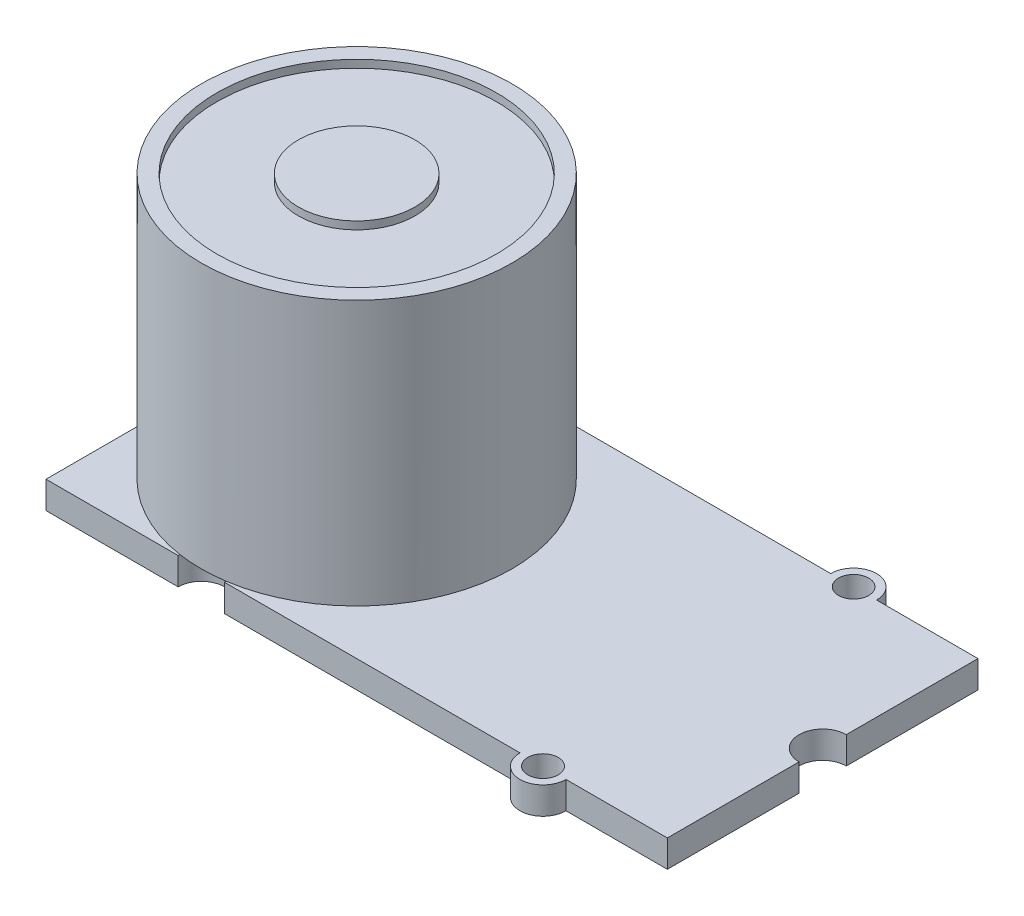
ISO-10303-21;
HEADER;
FILE_DESCRIPTION(('STEP AP214'),'2;1');
FILE_NAME('part.step','',(''),(''),'','','');
FILE_SCHEMA(('AUTOMOTIVE_DESIGN { 1 0 10303 214 1 1 1 1 }'));
ENDSEC;
DATA;
#1=APPLICATION_CONTEXT('core data for automotive mechanical design processes');
#2=APPLICATION_PROTOCOL_DEFINITION('international standard','automotive_design',2000,#1);
#3=PRODUCT_CONTEXT('',#1,'mechanical');
#4=PRODUCT('Part','Part','',(#3));
#5=PRODUCT_RELATED_PRODUCT_CATEGORY('part','',(#4));
#6=PRODUCT_DEFINITION_FORMATION('','',#4);
#7=PRODUCT_DEFINITION_CONTEXT('part definition',#1,'design');
#8=PRODUCT_DEFINITION('design','',#6,#7);
#9=PRODUCT_DEFINITION_SHAPE('','',#8);
#10=(LENGTH_UNIT() NAMED_UNIT(*) SI_UNIT(.MILLI.,.METRE.));
#11=(NAMED_UNIT(*) PLANE_ANGLE_UNIT() SI_UNIT($,.RADIAN.));
#12=(NAMED_UNIT(*) SI_UNIT($,.STERADIAN.) SOLID_ANGLE_UNIT());
#13=UNCERTAINTY_MEASURE_WITH_UNIT(LENGTH_MEASURE(1.E-05),#10,'distance_accuracy_value','');
#14=(GEOMETRIC_REPRESENTATION_CONTEXT(3) GLOBAL_UNCERTAINTY_ASSIGNED_CONTEXT((#13)) GLOBAL_UNIT_ASSIGNED_CONTEXT((#10,
#11,#12)) REPRESENTATION_CONTEXT('',''));
#15=CARTESIAN_POINT('',(0.,0.,0.));
#16=DIRECTION('',(0.,0.,1.));
#17=DIRECTION('',(1.,0.,0.));
#18=AXIS2_PLACEMENT_3D('',#15,#16,#17);
#19=CARTESIAN_POINT('',(-20.,1.75,-10.));
#20=DIRECTION('',(0.,0.,1.));
#21=DIRECTION('',(1.,0.,0.));
#22=AXIS2_PLACEMENT_3D('',#19,#20,#21);
#23=PLANE('',#22);
#24=DIRECTION('',(-1.,0.,0.));
#25=VECTOR('',#24,1.);
#26=CARTESIAN_POINT('',(-20.,0.,-10.));
#27=LINE('',#26,#25);
#28=CARTESIAN_POINT('',(20.,0.,-10.));
#29=VERTEX_POINT('',#28);
#30=CARTESIAN_POINT('',(13.4700440446538,0.,-10.));
#31=VERTEX_POINT('',#30);
#32=EDGE_CURVE('E182',#29,#31,#27,.T.);
#33=ORIENTED_EDGE('',*,*,#32,.T.);
#34=DIRECTION('',(0.,1.,0.));
#35=VECTOR('',#34,1.);
#36=CARTESIAN_POINT('',(13.4700440446538,-4.19218826280696,-10.));
#37=LINE('',#36,#35);
#38=CARTESIAN_POINT('',(13.4700440446538,1.75,-10.));
#39=VERTEX_POINT('',#38);
#40=EDGE_CURVE('E168',#31,#39,#37,.T.);
#41=ORIENTED_EDGE('',*,*,#40,.T.);
#42=DIRECTION('',(-1.,0.,0.));
#43=VECTOR('',#42,1.);
#44=CARTESIAN_POINT('',(-20.,1.75,-10.));
#45=LINE('',#44,#43);
#46=CARTESIAN_POINT('',(20.,1.75,-10.));
#47=VERTEX_POINT('',#46);
#48=EDGE_CURVE('E179',#47,#39,#45,.T.);
#49=ORIENTED_EDGE('',*,*,#48,.F.);
#50=DIRECTION('',(0.,-1.,0.));
#51=VECTOR('',#50,1.);
#52=CARTESIAN_POINT('',(20.,1.75,-10.));
#53=LINE('',#52,#51);
#54=EDGE_CURVE('E430',#47,#29,#53,.T.);
#55=ORIENTED_EDGE('',*,*,#54,.T.);
#56=EDGE_LOOP('',(#33,#41,#49,#55));
#57=FACE_BOUND('',#56,.T.);
#58=ADVANCED_FACE('F51',(#57),#23,.F.);
#59=CARTESIAN_POINT('',(-20.,1.75,10.));
#60=DIRECTION('',(0.,0.,-1.));
#61=DIRECTION('',(-1.,0.,0.));
#62=AXIS2_PLACEMENT_3D('',#59,#60,#61);
#63=PLANE('',#62);
#64=DIRECTION('',(1.,0.,0.));
#65=VECTOR('',#64,1.);
#66=CARTESIAN_POINT('',(-20.,0.,10.));
#67=LINE('',#66,#65);
#68=CARTESIAN_POINT('',(-8.50551142275667,0.,10.));
#69=VERTEX_POINT('',#68);
#70=CARTESIAN_POINT('',(10.511788005974,0.,10.));
#71=VERTEX_POINT('',#70);
#72=EDGE_CURVE('E409',#69,#71,#67,.T.);
#73=ORIENTED_EDGE('',*,*,#72,.T.);
#74=DIRECTION('',(0.,1.,0.));
#75=VECTOR('',#74,1.);
#76=CARTESIAN_POINT('',(10.511788005974,-4.19218826280696,10.));
#77=LINE('',#76,#75);
#78=CARTESIAN_POINT('',(10.511788005974,1.75,10.));
#79=VERTEX_POINT('',#78);
#80=EDGE_CURVE('E280',#71,#79,#77,.T.);
#81=ORIENTED_EDGE('',*,*,#80,.T.);
#82=DIRECTION('',(1.,0.,0.));
#83=VECTOR('',#82,1.);
#84=CARTESIAN_POINT('',(-20.,1.75,10.));
#85=LINE('',#84,#83);
#86=CARTESIAN_POINT('',(-8.50551142275667,1.75,10.));
#87=VERTEX_POINT('',#86);
#88=EDGE_CURVE('E448',#87,#79,#85,.T.);
#89=ORIENTED_EDGE('',*,*,#88,.F.);
#90=DIRECTION('',(0.,-1.,0.));
#91=VECTOR('',#90,1.);
#92=CARTESIAN_POINT('',(-8.50551142275667,6.11740276973975,10.));
#93=LINE('',#92,#91);
#94=EDGE_CURVE('E251',#87,#69,#93,.T.);
#95=ORIENTED_EDGE('',*,*,#94,.T.);
#96=EDGE_LOOP('',(#73,#81,#89,#95));
#97=FACE_BOUND('',#96,.T.);
#98=ADVANCED_FACE('F342',(#97),#63,.F.);
#99=CARTESIAN_POINT('',(-11.5441100573279,1.75,-10.));
#100=VERTEX_POINT('',#99);
#101=CARTESIAN_POINT('',(-20.,1.75,-10.));
#102=VERTEX_POINT('',#101);
#103=EDGE_CURVE('E194',#100,#102,#45,.T.);
#104=ORIENTED_EDGE('',*,*,#103,.F.);
#105=DIRECTION('',(0.,-1.,0.));
#106=VECTOR('',#105,1.);
#107=CARTESIAN_POINT('',(-11.5441100573279,6.11740276973975,-10.));
#108=LINE('',#107,#106);
#109=CARTESIAN_POINT('',(-11.5441100573279,0.,-10.));
#110=VERTEX_POINT('',#109);
#111=EDGE_CURVE('E259',#100,#110,#108,.T.);
#112=ORIENTED_EDGE('',*,*,#111,.T.);
#113=CARTESIAN_POINT('',(-20.,0.,-10.));
#114=VERTEX_POINT('',#113);
#115=EDGE_CURVE('E398',#110,#114,#27,.T.);
#116=ORIENTED_EDGE('',*,*,#115,.T.);
#117=DIRECTION('',(0.,-1.,0.));
#118=VECTOR('',#117,1.);
#119=CARTESIAN_POINT('',(-20.,1.75,-10.));
#120=LINE('',#119,#118);
#121=EDGE_CURVE('E426',#102,#114,#120,.T.);
#122=ORIENTED_EDGE('',*,*,#121,.F.);
#123=EDGE_LOOP('',(#104,#112,#116,#122));
#124=FACE_BOUND('',#123,.T.);
#125=ADVANCED_FACE('F343',(#124),#23,.F.);
#126=CARTESIAN_POINT('',(13.4761127546155,1.75,10.));
#127=VERTEX_POINT('',#126);
#128=CARTESIAN_POINT('',(20.,1.75,10.));
#129=VERTEX_POINT('',#128);
#130=EDGE_CURVE('E446',#127,#129,#85,.T.);
#131=ORIENTED_EDGE('',*,*,#130,.F.);
#132=DIRECTION('',(0.,1.,0.));
#133=VECTOR('',#132,1.);
#134=CARTESIAN_POINT('',(13.4761127546155,-4.19218826280696,10.));
#135=LINE('',#134,#133);
#136=CARTESIAN_POINT('',(13.4761127546155,0.,10.));
#137=VERTEX_POINT('',#136);
#138=EDGE_CURVE('E284',#127,#137,#135,.F.);
#139=ORIENTED_EDGE('',*,*,#138,.T.);
#140=CARTESIAN_POINT('',(20.,0.,10.));
#141=VERTEX_POINT('',#140);
#142=EDGE_CURVE('E406',#137,#141,#67,.T.);
#143=ORIENTED_EDGE('',*,*,#142,.T.);
#144=DIRECTION('',(0.,-1.,0.));
#145=VECTOR('',#144,1.);
#146=CARTESIAN_POINT('',(20.,1.75,10.));
#147=LINE('',#146,#145);
#148=EDGE_CURVE('E418',#129,#141,#147,.T.);
#149=ORIENTED_EDGE('',*,*,#148,.F.);
#150=EDGE_LOOP('',(#131,#139,#143,#149));
#151=FACE_BOUND('',#150,.T.);
#152=ADVANCED_FACE('F351',(#151),#63,.F.);
#153=CARTESIAN_POINT('',(20.,1.75,10.));
#154=DIRECTION('',(-1.,0.,0.));
#155=DIRECTION('',(0.,0.,1.));
#156=AXIS2_PLACEMENT_3D('',#153,#154,#155);
#157=PLANE('',#156);
#158=DIRECTION('',(0.,0.,-1.));
#159=VECTOR('',#158,1.);
#160=CARTESIAN_POINT('',(20.,0.,10.));
#161=LINE('',#160,#159);
#162=CARTESIAN_POINT('',(20.,0.,1.51952543444379));
#163=VERTEX_POINT('',#162);
#164=EDGE_CURVE('E394',#141,#163,#161,.T.);
#165=ORIENTED_EDGE('',*,*,#164,.T.);
#166=DIRECTION('',(0.,1.,0.));
#167=VECTOR('',#166,1.);
#168=CARTESIAN_POINT('',(20.,0.,1.51952543444379));
#169=LINE('',#168,#167);
#170=CARTESIAN_POINT('',(20.,1.75,1.51952543444379));
#171=VERTEX_POINT('',#170);
#172=EDGE_CURVE('E237',#163,#171,#169,.T.);
#173=ORIENTED_EDGE('',*,*,#172,.T.);
#174=DIRECTION('',(0.,0.,-1.));
#175=VECTOR('',#174,1.);
#176=CARTESIAN_POINT('',(20.,1.75,10.));
#177=LINE('',#176,#175);
#178=EDGE_CURVE('E201',#129,#171,#177,.T.);
#179=ORIENTED_EDGE('',*,*,#178,.F.);
#180=ORIENTED_EDGE('',*,*,#148,.T.);
#181=EDGE_LOOP('',(#165,#173,#179,#180));
#182=FACE_BOUND('',#181,.T.);
#183=ADVANCED_FACE('F366',(#182),#157,.F.);
#184=CARTESIAN_POINT('',(0.,1.75,0.));
#185=DIRECTION('',(0.,-1.,0.));
#186=DIRECTION('',(0.,0.,-1.));
#187=AXIS2_PLACEMENT_3D('',#184,#185,#186);
#188=PLANE('',#187);
#189=CARTESIAN_POINT('',(-10.,1.75,0.));
#190=DIRECTION('',(0.,-1.,0.));
#191=DIRECTION('',(0.,0.,-1.));
#192=AXIS2_PLACEMENT_3D('',#189,#190,#191);
#193=CIRCLE('',#192,10.);
#194=CARTESIAN_POINT('',(-11.5395011986325,1.75,-9.88078620654293));
#195=VERTEX_POINT('',#194);
#196=CARTESIAN_POINT('',(-20.,1.75,0.));
#197=VERTEX_POINT('',#196);
#198=EDGE_CURVE('E219',#195,#197,#193,.F.);
#199=ORIENTED_EDGE('',*,*,#198,.F.);
#200=CARTESIAN_POINT('',(-10.,1.75,-10.));
#201=DIRECTION('',(0.,-1.,0.));
#202=DIRECTION('',(0.,0.,-1.));
#203=AXIS2_PLACEMENT_3D('',#200,#201,#202);
#204=CIRCLE('',#203,1.54411005732794);
#205=EDGE_CURVE('E272',#100,#195,#204,.F.);
#206=ORIENTED_EDGE('',*,*,#205,.F.);
#207=ORIENTED_EDGE('',*,*,#103,.T.);
#208=DIRECTION('',(0.,0.,1.));
#209=VECTOR('',#208,1.);
#210=CARTESIAN_POINT('',(-20.,1.75,10.));
#211=LINE('',#210,#209);
#212=EDGE_CURVE('E197',#102,#197,#211,.T.);
#213=ORIENTED_EDGE('',*,*,#212,.T.);
#214=EDGE_LOOP('',(#199,#206,#207,#213));
#215=FACE_BOUND('',#214,.T.);
#216=ADVANCED_FACE('F327',(#215),#188,.F.);
#217=CARTESIAN_POINT('',(-20.,1.75,10.));
#218=VERTEX_POINT('',#217);
#219=CARTESIAN_POINT('',(-11.4944885772433,1.75,10.));
#220=VERTEX_POINT('',#219);
#221=EDGE_CURVE('E423',#218,#220,#85,.T.);
#222=ORIENTED_EDGE('',*,*,#221,.T.);
#223=CARTESIAN_POINT('',(-10.,1.75,10.));
#224=DIRECTION('',(0.,-1.,0.));
#225=DIRECTION('',(0.,0.,-1.));
#226=AXIS2_PLACEMENT_3D('',#223,#224,#225);
#227=CIRCLE('',#226,1.49448857724334);
#228=CARTESIAN_POINT('',(-11.4903103184757,1.75,9.88832519462446));
#229=VERTEX_POINT('',#228);
#230=EDGE_CURVE('E267',#229,#220,#227,.F.);
#231=ORIENTED_EDGE('',*,*,#230,.F.);
#232=EDGE_CURVE('E217',#197,#229,#193,.F.);
#233=ORIENTED_EDGE('',*,*,#232,.F.);
#234=EDGE_CURVE('E191',#197,#218,#211,.T.);
#235=ORIENTED_EDGE('',*,*,#234,.T.);
#236=EDGE_LOOP('',(#222,#231,#233,#235));
#237=FACE_BOUND('',#236,.T.);
#238=ADVANCED_FACE('F328',(#237),#188,.F.);
#239=CARTESIAN_POINT('',(20.,1.75,-1.51952543444378));
#240=VERTEX_POINT('',#239);
#241=EDGE_CURVE('E189',#240,#47,#177,.T.);
#242=ORIENTED_EDGE('',*,*,#241,.F.);
#243=DIRECTION('',(0.,1.,0.));
#244=VECTOR('',#243,1.);
#245=CARTESIAN_POINT('',(20.,0.,-1.51952543444378));
#246=LINE('',#245,#244);
#247=CARTESIAN_POINT('',(20.,0.,-1.51952543444378));
#248=VERTEX_POINT('',#247);
#249=EDGE_CURVE('E244',#240,#248,#246,.F.);
#250=ORIENTED_EDGE('',*,*,#249,.T.);
#251=EDGE_CURVE('E392',#248,#29,#161,.T.);
#252=ORIENTED_EDGE('',*,*,#251,.T.);
#253=ORIENTED_EDGE('',*,*,#54,.F.);
#254=EDGE_LOOP('',(#242,#250,#252,#253));
#255=FACE_BOUND('',#254,.T.);
#256=ADVANCED_FACE('F53',(#255),#157,.F.);
#257=CARTESIAN_POINT('',(10.5178567159357,1.75,-10.));
#258=VERTEX_POINT('',#257);
#259=CARTESIAN_POINT('',(-8.45588994267206,1.75,-10.));
#260=VERTEX_POINT('',#259);
#261=EDGE_CURVE('E192',#258,#260,#45,.T.);
#262=ORIENTED_EDGE('',*,*,#261,.F.);
#263=DIRECTION('',(0.,1.,0.));
#264=VECTOR('',#263,1.);
#265=CARTESIAN_POINT('',(10.5178567159357,-4.19218826280696,-10.));
#266=LINE('',#265,#264);
#267=CARTESIAN_POINT('',(10.5178567159357,0.,-10.));
#268=VERTEX_POINT('',#267);
#269=EDGE_CURVE('E169',#258,#268,#266,.F.);
#270=ORIENTED_EDGE('',*,*,#269,.T.);
#271=CARTESIAN_POINT('',(-8.45588994267206,0.,-10.));
#272=VERTEX_POINT('',#271);
#273=EDGE_CURVE('E400',#268,#272,#27,.T.);
#274=ORIENTED_EDGE('',*,*,#273,.T.);
#275=DIRECTION('',(0.,-1.,0.));
#276=VECTOR('',#275,1.);
#277=CARTESIAN_POINT('',(-8.45588994267206,6.11740276973975,-10.));
#278=LINE('',#277,#276);
#279=EDGE_CURVE('E263',#272,#260,#278,.F.);
#280=ORIENTED_EDGE('',*,*,#279,.T.);
#281=EDGE_LOOP('',(#262,#270,#274,#280));
#282=FACE_BOUND('',#281,.T.);
#283=ADVANCED_FACE('F344',(#282),#23,.F.);
#284=CARTESIAN_POINT('',(-20.,1.75,10.));
#285=DIRECTION('',(1.,0.,0.));
#286=DIRECTION('',(0.,0.,-1.));
#287=AXIS2_PLACEMENT_3D('',#284,#285,#286);
#288=PLANE('',#287);
#289=DIRECTION('',(0.,0.,1.));
#290=VECTOR('',#289,1.);
#291=CARTESIAN_POINT('',(-20.,0.,10.));
#292=LINE('',#291,#290);
#293=CARTESIAN_POINT('',(-20.,0.,10.));
#294=VERTEX_POINT('',#293);
#295=EDGE_CURVE('E404',#114,#294,#292,.T.);
#296=ORIENTED_EDGE('',*,*,#295,.T.);
#297=DIRECTION('',(0.,-1.,0.));
#298=VECTOR('',#297,1.);
#299=CARTESIAN_POINT('',(-20.,1.75,10.));
#300=LINE('',#299,#298);
#301=EDGE_CURVE('E422',#218,#294,#300,.T.);
#302=ORIENTED_EDGE('',*,*,#301,.F.);
#303=ORIENTED_EDGE('',*,*,#234,.F.);
#304=ORIENTED_EDGE('',*,*,#212,.F.);
#305=ORIENTED_EDGE('',*,*,#121,.T.);
#306=EDGE_LOOP('',(#296,#302,#303,#304,#305));
#307=FACE_BOUND('',#306,.T.);
#308=ADVANCED_FACE('F356',(#307),#288,.F.);
#309=CARTESIAN_POINT('',(-11.4944885772433,0.,10.));
#310=VERTEX_POINT('',#309);
#311=EDGE_CURVE('E211',#294,#310,#67,.T.);
#312=ORIENTED_EDGE('',*,*,#311,.T.);
#313=DIRECTION('',(0.,-1.,0.));
#314=VECTOR('',#313,1.);
#315=CARTESIAN_POINT('',(-11.4944885772433,6.11740276973975,10.));
#316=LINE('',#315,#314);
#317=EDGE_CURVE('E255',#310,#220,#316,.F.);
#318=ORIENTED_EDGE('',*,*,#317,.T.);
#319=ORIENTED_EDGE('',*,*,#221,.F.);
#320=ORIENTED_EDGE('',*,*,#301,.T.);
#321=EDGE_LOOP('',(#312,#318,#319,#320));
#322=FACE_BOUND('',#321,.T.);
#323=ADVANCED_FACE('F325',(#322),#63,.F.);
#324=CARTESIAN_POINT('',(11.9939503802948,1.75,-10.));
#325=DIRECTION('',(0.,1.,0.));
#326=DIRECTION('',(0.,0.,1.));
#327=AXIS2_PLACEMENT_3D('',#324,#325,#326);
#328=CIRCLE('',#327,0.972887347682979);
#329=CARTESIAN_POINT('',(11.9939503802948,1.75,-9.02711265231702));
#330=VERTEX_POINT('',#329);
#331=EDGE_CURVE('E305',#330,#330,#328,.T.);
#332=ORIENTED_EDGE('',*,*,#331,.F.);
#333=EDGE_LOOP('',(#332));
#334=FACE_BOUND('',#333,.T.);
#335=CARTESIAN_POINT('',(11.9939503802948,1.75,10.));
#336=DIRECTION('',(0.,1.,0.));
#337=DIRECTION('',(0.,0.,1.));
#338=AXIS2_PLACEMENT_3D('',#335,#336,#337);
#339=CIRCLE('',#338,0.978406893726433);
#340=CARTESIAN_POINT('',(11.9939503802948,1.75,10.9784068937264));
#341=VERTEX_POINT('',#340);
#342=EDGE_CURVE('E301',#341,#341,#339,.T.);
#343=ORIENTED_EDGE('',*,*,#342,.F.);
#344=EDGE_LOOP('',(#343));
#345=FACE_BOUND('',#344,.T.);
#346=ORIENTED_EDGE('',*,*,#48,.T.);
#347=CARTESIAN_POINT('',(11.9939503802948,1.75,-10.));
#348=DIRECTION('',(0.,1.,0.));
#349=DIRECTION('',(0.,0.,1.));
#350=AXIS2_PLACEMENT_3D('',#347,#348,#349);
#351=CIRCLE('',#350,1.47609366435908);
#352=EDGE_CURVE('E165',#39,#258,#351,.T.);
#353=ORIENTED_EDGE('',*,*,#352,.T.);
#354=ORIENTED_EDGE('',*,*,#261,.T.);
#355=CARTESIAN_POINT('',(-8.46049880136751,1.75,-9.88078620654294));
#356=VERTEX_POINT('',#355);
#357=EDGE_CURVE('E276',#356,#260,#204,.F.);
#358=ORIENTED_EDGE('',*,*,#357,.F.);
#359=CARTESIAN_POINT('',(-8.5096896815243,1.75,9.88832519462446));
#360=VERTEX_POINT('',#359);
#361=EDGE_CURVE('E218',#360,#356,#193,.F.);
#362=ORIENTED_EDGE('',*,*,#361,.F.);
#363=EDGE_CURVE('E279',#87,#360,#227,.F.);
#364=ORIENTED_EDGE('',*,*,#363,.F.);
#365=ORIENTED_EDGE('',*,*,#88,.T.);
#366=CARTESIAN_POINT('',(11.9939503802948,1.75,10.));
#367=DIRECTION('',(0.,1.,0.));
#368=DIRECTION('',(0.,0.,1.));
#369=AXIS2_PLACEMENT_3D('',#366,#367,#368);
#370=CIRCLE('',#369,1.48216237432073);
#371=EDGE_CURVE('E184',#79,#127,#370,.T.);
#372=ORIENTED_EDGE('',*,*,#371,.T.);
#373=ORIENTED_EDGE('',*,*,#130,.T.);
#374=ORIENTED_EDGE('',*,*,#178,.T.);
#375=CARTESIAN_POINT('',(20.,1.75,0.));
#376=DIRECTION('',(0.,1.,0.));
#377=DIRECTION('',(0.,0.,1.));
#378=AXIS2_PLACEMENT_3D('',#375,#376,#377);
#379=CIRCLE('',#378,1.51952543444378);
#380=EDGE_CURVE('E248',#240,#171,#379,.T.);
#381=ORIENTED_EDGE('',*,*,#380,.F.);
#382=ORIENTED_EDGE('',*,*,#241,.T.);
#383=EDGE_LOOP('',(#346,#353,#354,#358,#362,#364,#365,#372,#373,#374,#381,#382));
#384=FACE_BOUND('',#383,.T.);
#385=ADVANCED_FACE('F186',(#334,#345,#384),#188,.F.);
#386=CARTESIAN_POINT('',(0.,0.,0.));
#387=DIRECTION('',(0.,-1.,0.));
#388=DIRECTION('',(0.,0.,-1.));
#389=AXIS2_PLACEMENT_3D('',#386,#387,#388);
#390=PLANE('',#389);
#391=CARTESIAN_POINT('',(11.9939503802948,0.,-10.));
#392=DIRECTION('',(0.,1.,0.));
#393=DIRECTION('',(0.,0.,1.));
#394=AXIS2_PLACEMENT_3D('',#391,#392,#393);
#395=CIRCLE('',#394,0.972887347682979);
#396=CARTESIAN_POINT('',(11.9939503802948,0.,-9.02711265231702));
#397=VERTEX_POINT('',#396);
#398=EDGE_CURVE('E296',#397,#397,#395,.T.);
#399=ORIENTED_EDGE('',*,*,#398,.T.);
#400=EDGE_LOOP('',(#399));
#401=FACE_BOUND('',#400,.T.);
#402=CARTESIAN_POINT('',(11.9939503802948,0.,10.));
#403=DIRECTION('',(0.,1.,0.));
#404=DIRECTION('',(0.,0.,1.));
#405=AXIS2_PLACEMENT_3D('',#402,#403,#404);
#406=CIRCLE('',#405,0.978406893726433);
#407=CARTESIAN_POINT('',(11.9939503802948,0.,10.9784068937264));
#408=VERTEX_POINT('',#407);
#409=EDGE_CURVE('E297',#408,#408,#406,.T.);
#410=ORIENTED_EDGE('',*,*,#409,.T.);
#411=EDGE_LOOP('',(#410));
#412=FACE_BOUND('',#411,.T.);
#413=ORIENTED_EDGE('',*,*,#273,.F.);
#414=CARTESIAN_POINT('',(11.9939503802948,0.,-10.));
#415=DIRECTION('',(0.,-1.,0.));
#416=DIRECTION('',(0.,0.,-1.));
#417=AXIS2_PLACEMENT_3D('',#414,#415,#416);
#418=CIRCLE('',#417,1.47609366435908);
#419=EDGE_CURVE('E67',#31,#268,#418,.F.);
#420=ORIENTED_EDGE('',*,*,#419,.F.);
#421=ORIENTED_EDGE('',*,*,#32,.F.);
#422=ORIENTED_EDGE('',*,*,#251,.F.);
#423=CARTESIAN_POINT('',(20.,0.,0.));
#424=DIRECTION('',(0.,-1.,0.));
#425=DIRECTION('',(0.,0.,-1.));
#426=AXIS2_PLACEMENT_3D('',#423,#424,#425);
#427=CIRCLE('',#426,1.51952543444378);
#428=EDGE_CURVE('E60',#163,#248,#427,.T.);
#429=ORIENTED_EDGE('',*,*,#428,.F.);
#430=ORIENTED_EDGE('',*,*,#164,.F.);
#431=ORIENTED_EDGE('',*,*,#142,.F.);
#432=CARTESIAN_POINT('',(11.9939503802948,0.,10.));
#433=DIRECTION('',(0.,-1.,0.));
#434=DIRECTION('',(0.,0.,-1.));
#435=AXIS2_PLACEMENT_3D('',#432,#433,#434);
#436=CIRCLE('',#435,1.48216237432073);
#437=EDGE_CURVE('E75',#71,#137,#436,.F.);
#438=ORIENTED_EDGE('',*,*,#437,.F.);
#439=ORIENTED_EDGE('',*,*,#72,.F.);
#440=CARTESIAN_POINT('',(-10.,0.,10.));
#441=DIRECTION('',(0.,-1.,0.));
#442=DIRECTION('',(0.,0.,-1.));
#443=AXIS2_PLACEMENT_3D('',#440,#441,#442);
#444=CIRCLE('',#443,1.49448857724334);
#445=EDGE_CURVE('E12',#310,#69,#444,.T.);
#446=ORIENTED_EDGE('',*,*,#445,.F.);
#447=ORIENTED_EDGE('',*,*,#311,.F.);
#448=ORIENTED_EDGE('',*,*,#295,.F.);
#449=ORIENTED_EDGE('',*,*,#115,.F.);
#450=CARTESIAN_POINT('',(-10.,0.,-10.));
#451=DIRECTION('',(0.,-1.,0.));
#452=DIRECTION('',(0.,0.,-1.));
#453=AXIS2_PLACEMENT_3D('',#450,#451,#452);
#454=CIRCLE('',#453,1.54411005732794);
#455=EDGE_CURVE('E268',#272,#110,#454,.T.);
#456=ORIENTED_EDGE('',*,*,#455,.F.);
#457=EDGE_LOOP('',(#413,#420,#421,#422,#429,#430,#431,#438,#439,#446,#447,#448,#449,#456));
#458=FACE_BOUND('',#457,.T.);
#459=ADVANCED_FACE('F313',(#401,#412,#458),#390,.T.);
#460=CARTESIAN_POINT('',(-10.,18.8,0.));
#461=DIRECTION('',(0.,-1.,0.));
#462=DIRECTION('',(0.,0.,-1.));
#463=AXIS2_PLACEMENT_3D('',#460,#461,#462);
#464=CYLINDRICAL_SURFACE('',#463,10.);
#465=CARTESIAN_POINT('',(-10.,18.8,0.));
#466=DIRECTION('',(0.,1.,0.));
#467=DIRECTION('',(0.,0.,1.));
#468=AXIS2_PLACEMENT_3D('',#465,#466,#467);
#469=CIRCLE('',#468,10.);
#470=CARTESIAN_POINT('',(-10.,18.8,10.));
#471=VERTEX_POINT('',#470);
#472=EDGE_CURVE('E220',#471,#471,#469,.T.);
#473=ORIENTED_EDGE('',*,*,#472,.F.);
#474=EDGE_LOOP('',(#473));
#475=FACE_BOUND('',#474,.T.);
#476=EDGE_CURVE('E213',#229,#360,#193,.F.);
#477=ORIENTED_EDGE('',*,*,#476,.T.);
#478=ORIENTED_EDGE('',*,*,#361,.T.);
#479=EDGE_CURVE('E385',#356,#195,#193,.F.);
#480=ORIENTED_EDGE('',*,*,#479,.T.);
#481=ORIENTED_EDGE('',*,*,#198,.T.);
#482=ORIENTED_EDGE('',*,*,#232,.T.);
#483=EDGE_LOOP('',(#477,#478,#480,#481,#482));
#484=FACE_BOUND('',#483,.T.);
#485=ADVANCED_FACE('F486',(#475,#484),#464,.T.);
#486=CARTESIAN_POINT('',(-10.,18.8,0.));
#487=DIRECTION('',(0.,1.,0.));
#488=DIRECTION('',(0.,0.,1.));
#489=AXIS2_PLACEMENT_3D('',#486,#487,#488);
#490=PLANE('',#489);
#491=CARTESIAN_POINT('',(-10.,18.8,0.));
#492=DIRECTION('',(0.,1.,0.));
#493=DIRECTION('',(0.,0.,1.));
#494=AXIS2_PLACEMENT_3D('',#491,#492,#493);
#495=CIRCLE('',#494,8.99893097416932);
#496=CARTESIAN_POINT('',(-10.,18.8,8.99893097416932));
#497=VERTEX_POINT('',#496);
#498=EDGE_CURVE('E225',#497,#497,#495,.T.);
#499=ORIENTED_EDGE('',*,*,#498,.F.);
#500=EDGE_LOOP('',(#499));
#501=FACE_BOUND('',#500,.T.);
#502=ORIENTED_EDGE('',*,*,#472,.T.);
#503=EDGE_LOOP('',(#502));
#504=FACE_BOUND('',#503,.T.);
#505=ADVANCED_FACE('F490',(#501,#504),#490,.T.);
#506=CARTESIAN_POINT('',(-10.,18.3,0.));
#507=DIRECTION('',(0.,1.,0.));
#508=DIRECTION('',(0.,0.,1.));
#509=AXIS2_PLACEMENT_3D('',#506,#507,#508);
#510=CYLINDRICAL_SURFACE('',#509,8.99893097416932);
#511=CARTESIAN_POINT('',(-10.,18.3,0.));
#512=DIRECTION('',(0.,1.,0.));
#513=DIRECTION('',(0.,0.,1.));
#514=AXIS2_PLACEMENT_3D('',#511,#512,#513);
#515=CIRCLE('',#514,8.99893097416932);
#516=CARTESIAN_POINT('',(-10.,18.3,8.99893097416932));
#517=VERTEX_POINT('',#516);
#518=EDGE_CURVE('E224',#517,#517,#515,.T.);
#519=ORIENTED_EDGE('',*,*,#518,.F.);
#520=EDGE_LOOP('',(#519));
#521=FACE_BOUND('',#520,.T.);
#522=ORIENTED_EDGE('',*,*,#498,.T.);
#523=EDGE_LOOP('',(#522));
#524=FACE_BOUND('',#523,.T.);
#525=ADVANCED_FACE('F598',(#521,#524),#510,.F.);
#526=CARTESIAN_POINT('',(-10.,18.3,0.));
#527=DIRECTION('',(0.,1.,0.));
#528=DIRECTION('',(0.,0.,1.));
#529=AXIS2_PLACEMENT_3D('',#526,#527,#528);
#530=PLANE('',#529);
#531=CARTESIAN_POINT('',(-10.,18.3,0.));
#532=DIRECTION('',(0.,1.,0.));
#533=DIRECTION('',(0.,0.,1.));
#534=AXIS2_PLACEMENT_3D('',#531,#532,#533);
#535=CIRCLE('',#534,3.75);
#536=CARTESIAN_POINT('',(-10.,18.3,3.75));
#537=VERTEX_POINT('',#536);
#538=EDGE_CURVE('E229',#537,#537,#535,.T.);
#539=ORIENTED_EDGE('',*,*,#538,.F.);
#540=EDGE_LOOP('',(#539));
#541=FACE_BOUND('',#540,.T.);
#542=ORIENTED_EDGE('',*,*,#518,.T.);
#543=EDGE_LOOP('',(#542));
#544=FACE_BOUND('',#543,.T.);
#545=ADVANCED_FACE('F594',(#541,#544),#530,.T.);
#546=CARTESIAN_POINT('',(-10.,18.3,0.));
#547=DIRECTION('',(0.,1.,0.));
#548=DIRECTION('',(0.,0.,1.));
#549=AXIS2_PLACEMENT_3D('',#546,#547,#548);
#550=CYLINDRICAL_SURFACE('',#549,3.75);
#551=ORIENTED_EDGE('',*,*,#538,.T.);
#552=EDGE_LOOP('',(#551));
#553=FACE_BOUND('',#552,.T.);
#554=CARTESIAN_POINT('',(-10.,18.8,0.));
#555=DIRECTION('',(0.,1.,0.));
#556=DIRECTION('',(0.,0.,1.));
#557=AXIS2_PLACEMENT_3D('',#554,#555,#556);
#558=CIRCLE('',#557,3.75);
#559=CARTESIAN_POINT('',(-10.,18.8,3.75));
#560=VERTEX_POINT('',#559);
#561=EDGE_CURVE('E233',#560,#560,#558,.T.);
#562=ORIENTED_EDGE('',*,*,#561,.F.);
#563=EDGE_LOOP('',(#562));
#564=FACE_BOUND('',#563,.T.);
#565=ADVANCED_FACE('F591',(#553,#564),#550,.T.);
#566=ORIENTED_EDGE('',*,*,#561,.T.);
#567=EDGE_LOOP('',(#566));
#568=FACE_BOUND('',#567,.T.);
#569=ADVANCED_FACE('F590',(#568),#490,.T.);
#570=CARTESIAN_POINT('',(20.,0.,0.));
#571=DIRECTION('',(0.,1.,0.));
#572=DIRECTION('',(0.,0.,1.));
#573=AXIS2_PLACEMENT_3D('',#570,#571,#572);
#574=CYLINDRICAL_SURFACE('',#573,1.51952543444378);
#575=ORIENTED_EDGE('',*,*,#428,.T.);
#576=ORIENTED_EDGE('',*,*,#249,.F.);
#577=ORIENTED_EDGE('',*,*,#380,.T.);
#578=ORIENTED_EDGE('',*,*,#172,.F.);
#579=EDGE_LOOP('',(#575,#576,#577,#578));
#580=FACE_BOUND('',#579,.T.);
#581=ADVANCED_FACE('F435',(#580),#574,.F.);
#582=CARTESIAN_POINT('',(-10.,6.11740276973975,-10.));
#583=DIRECTION('',(0.,-1.,0.));
#584=DIRECTION('',(0.,0.,-1.));
#585=AXIS2_PLACEMENT_3D('',#582,#583,#584);
#586=CYLINDRICAL_SURFACE('',#585,1.54411005732794);
#587=ORIENTED_EDGE('',*,*,#205,.T.);
#588=EDGE_CURVE('E275',#195,#356,#204,.F.);
#589=ORIENTED_EDGE('',*,*,#588,.T.);
#590=ORIENTED_EDGE('',*,*,#357,.T.);
#591=ORIENTED_EDGE('',*,*,#279,.F.);
#592=ORIENTED_EDGE('',*,*,#455,.T.);
#593=ORIENTED_EDGE('',*,*,#111,.F.);
#594=EDGE_LOOP('',(#587,#589,#590,#591,#592,#593));
#595=FACE_BOUND('',#594,.T.);
#596=ADVANCED_FACE('F375',(#595),#586,.F.);
#597=CARTESIAN_POINT('',(0.,1.75,0.));
#598=DIRECTION('',(0.,-1.,0.));
#599=DIRECTION('',(0.,0.,-1.));
#600=AXIS2_PLACEMENT_3D('',#597,#598,#599);
#601=PLANE('',#600);
#602=ORIENTED_EDGE('',*,*,#479,.F.);
#603=ORIENTED_EDGE('',*,*,#588,.F.);
#604=EDGE_LOOP('',(#602,#603));
#605=FACE_BOUND('',#604,.T.);
#606=ADVANCED_FACE('F501',(#605),#601,.T.);
#607=CARTESIAN_POINT('',(-10.,6.11740276973975,10.));
#608=DIRECTION('',(0.,-1.,0.));
#609=DIRECTION('',(0.,0.,-1.));
#610=AXIS2_PLACEMENT_3D('',#607,#608,#609);
#611=CYLINDRICAL_SURFACE('',#610,1.49448857724334);
#612=ORIENTED_EDGE('',*,*,#363,.T.);
#613=EDGE_CURVE('E271',#360,#229,#227,.F.);
#614=ORIENTED_EDGE('',*,*,#613,.T.);
#615=ORIENTED_EDGE('',*,*,#230,.T.);
#616=ORIENTED_EDGE('',*,*,#317,.F.);
#617=ORIENTED_EDGE('',*,*,#445,.T.);
#618=ORIENTED_EDGE('',*,*,#94,.F.);
#619=EDGE_LOOP('',(#612,#614,#615,#616,#617,#618));
#620=FACE_BOUND('',#619,.T.);
#621=ADVANCED_FACE('F510',(#620),#611,.F.);
#622=CARTESIAN_POINT('',(0.,1.75,0.));
#623=DIRECTION('',(0.,-1.,0.));
#624=DIRECTION('',(0.,0.,-1.));
#625=AXIS2_PLACEMENT_3D('',#622,#623,#624);
#626=PLANE('',#625);
#627=ORIENTED_EDGE('',*,*,#476,.F.);
#628=ORIENTED_EDGE('',*,*,#613,.F.);
#629=EDGE_LOOP('',(#627,#628));
#630=FACE_BOUND('',#629,.T.);
#631=ADVANCED_FACE('F518',(#630),#626,.T.);
#632=CARTESIAN_POINT('',(11.9939503802948,-4.19218826280696,10.));
#633=DIRECTION('',(0.,1.,0.));
#634=DIRECTION('',(0.,0.,1.));
#635=AXIS2_PLACEMENT_3D('',#632,#633,#634);
#636=CYLINDRICAL_SURFACE('',#635,1.48216237432073);
#637=ORIENTED_EDGE('',*,*,#80,.F.);
#638=ORIENTED_EDGE('',*,*,#437,.T.);
#639=ORIENTED_EDGE('',*,*,#138,.F.);
#640=ORIENTED_EDGE('',*,*,#371,.F.);
#641=EDGE_LOOP('',(#637,#638,#639,#640));
#642=FACE_BOUND('',#641,.T.);
#643=ADVANCED_FACE('F338',(#642),#636,.T.);
#644=CARTESIAN_POINT('',(11.9939503802948,-4.19218826280696,-10.));
#645=DIRECTION('',(0.,1.,0.));
#646=DIRECTION('',(0.,0.,1.));
#647=AXIS2_PLACEMENT_3D('',#644,#645,#646);
#648=CYLINDRICAL_SURFACE('',#647,1.47609366435908);
#649=ORIENTED_EDGE('',*,*,#40,.F.);
#650=ORIENTED_EDGE('',*,*,#419,.T.);
#651=ORIENTED_EDGE('',*,*,#269,.F.);
#652=ORIENTED_EDGE('',*,*,#352,.F.);
#653=EDGE_LOOP('',(#649,#650,#651,#652));
#654=FACE_BOUND('',#653,.T.);
#655=ADVANCED_FACE('F167',(#654),#648,.T.);
#656=CARTESIAN_POINT('',(11.9939503802948,0.,10.));
#657=DIRECTION('',(0.,1.,0.));
#658=DIRECTION('',(0.,0.,1.));
#659=AXIS2_PLACEMENT_3D('',#656,#657,#658);
#660=CYLINDRICAL_SURFACE('',#659,0.978406893726433);
#661=CARTESIAN_POINT('',(11.9939503802948,0.,10.9784068937264));
#662=CARTESIAN_POINT('',(11.9939503802948,0.0182291666666667,10.9784068937264));
#663=CARTESIAN_POINT('',(11.9939503802948,0.0364583333333333,10.9784068937264));
#664=CARTESIAN_POINT('',(11.9939503802948,0.0729166666666666,10.9784068937264));
#665=CARTESIAN_POINT('',(11.9939503802948,0.0911458333333333,10.9784068937264));
#666=CARTESIAN_POINT('',(11.9939503802948,0.127604166666667,10.9784068937264));
#667=CARTESIAN_POINT('',(11.9939503802948,0.145833333333333,10.9784068937264));
#668=CARTESIAN_POINT('',(11.9939503802948,0.182291666666667,10.9784068937264));
#669=CARTESIAN_POINT('',(11.9939503802948,0.200520833333333,10.9784068937264));
#670=CARTESIAN_POINT('',(11.9939503802948,0.236979166666667,10.9784068937264));
#671=CARTESIAN_POINT('',(11.9939503802948,0.255208333333333,10.9784068937264));
#672=CARTESIAN_POINT('',(11.9939503802948,0.291666666666667,10.9784068937264));
#673=CARTESIAN_POINT('',(11.9939503802948,0.309895833333333,10.9784068937264));
#674=CARTESIAN_POINT('',(11.9939503802948,0.346354166666667,10.9784068937264));
#675=CARTESIAN_POINT('',(11.9939503802948,0.364583333333333,10.9784068937264));
#676=CARTESIAN_POINT('',(11.9939503802948,0.401041666666667,10.9784068937264));
#677=CARTESIAN_POINT('',(11.9939503802948,0.419270833333333,10.9784068937264));
#678=CARTESIAN_POINT('',(11.9939503802948,0.455729166666667,10.9784068937264));
#679=CARTESIAN_POINT('',(11.9939503802948,0.473958333333333,10.9784068937264));
#680=CARTESIAN_POINT('',(11.9939503802948,0.510416666666667,10.9784068937264));
#681=CARTESIAN_POINT('',(11.9939503802948,0.528645833333333,10.9784068937264));
#682=CARTESIAN_POINT('',(11.9939503802948,0.565104166666666,10.9784068937264));
#683=CARTESIAN_POINT('',(11.9939503802948,0.583333333333333,10.9784068937264));
#684=CARTESIAN_POINT('',(11.9939503802948,0.619791666666667,10.9784068937264));
#685=CARTESIAN_POINT('',(11.9939503802948,0.638020833333333,10.9784068937264));
#686=CARTESIAN_POINT('',(11.9939503802948,0.674479166666667,10.9784068937264));
#687=CARTESIAN_POINT('',(11.9939503802948,0.692708333333333,10.9784068937264));
#688=CARTESIAN_POINT('',(11.9939503802948,0.729166666666667,10.9784068937264));
#689=CARTESIAN_POINT('',(11.9939503802948,0.747395833333333,10.9784068937264));
#690=CARTESIAN_POINT('',(11.9939503802948,0.783854166666666,10.9784068937264));
#691=CARTESIAN_POINT('',(11.9939503802948,0.802083333333333,10.9784068937264));
#692=CARTESIAN_POINT('',(11.9939503802948,0.838541666666667,10.9784068937264));
#693=CARTESIAN_POINT('',(11.9939503802948,0.856770833333333,10.9784068937264));
#694=CARTESIAN_POINT('',(11.9939503802948,0.893229166666667,10.9784068937264));
#695=CARTESIAN_POINT('',(11.9939503802948,0.911458333333333,10.9784068937264));
#696=CARTESIAN_POINT('',(11.9939503802948,0.947916666666666,10.9784068937264));
#697=CARTESIAN_POINT('',(11.9939503802948,0.966145833333333,10.9784068937264));
#698=CARTESIAN_POINT('',(11.9939503802948,1.00260416666667,10.9784068937264));
#699=CARTESIAN_POINT('',(11.9939503802948,1.02083333333333,10.9784068937264));
#700=CARTESIAN_POINT('',(11.9939503802948,1.05729166666667,10.9784068937264));
#701=CARTESIAN_POINT('',(11.9939503802948,1.07552083333333,10.9784068937264));
#702=CARTESIAN_POINT('',(11.9939503802948,1.11197916666667,10.9784068937264));
#703=CARTESIAN_POINT('',(11.9939503802948,1.13020833333333,10.9784068937264));
#704=CARTESIAN_POINT('',(11.9939503802948,1.16666666666667,10.9784068937264));
#705=CARTESIAN_POINT('',(11.9939503802948,1.18489583333333,10.9784068937264));
#706=CARTESIAN_POINT('',(11.9939503802948,1.22135416666667,10.9784068937264));
#707=CARTESIAN_POINT('',(11.9939503802948,1.23958333333333,10.9784068937264));
#708=CARTESIAN_POINT('',(11.9939503802948,1.27604166666667,10.9784068937264));
#709=CARTESIAN_POINT('',(11.9939503802948,1.29427083333333,10.9784068937264));
#710=CARTESIAN_POINT('',(11.9939503802948,1.33072916666667,10.9784068937264));
#711=CARTESIAN_POINT('',(11.9939503802948,1.34895833333333,10.9784068937264));
#712=CARTESIAN_POINT('',(11.9939503802948,1.38541666666667,10.9784068937264));
#713=CARTESIAN_POINT('',(11.9939503802948,1.40364583333333,10.9784068937264));
#714=CARTESIAN_POINT('',(11.9939503802948,1.44010416666667,10.9784068937264));
#715=CARTESIAN_POINT('',(11.9939503802948,1.45833333333333,10.9784068937264));
#716=CARTESIAN_POINT('',(11.9939503802948,1.49479166666667,10.9784068937264));
#717=CARTESIAN_POINT('',(11.9939503802948,1.51302083333333,10.9784068937264));
#718=CARTESIAN_POINT('',(11.9939503802948,1.54947916666667,10.9784068937264));
#719=CARTESIAN_POINT('',(11.9939503802948,1.56770833333333,10.9784068937264));
#720=CARTESIAN_POINT('',(11.9939503802948,1.60416666666667,10.9784068937264));
#721=CARTESIAN_POINT('',(11.9939503802948,1.62239583333333,10.9784068937264));
#722=CARTESIAN_POINT('',(11.9939503802948,1.65885416666667,10.9784068937264));
#723=CARTESIAN_POINT('',(11.9939503802948,1.67708333333333,10.9784068937264));
#724=CARTESIAN_POINT('',(11.9939503802948,1.71354166666667,10.9784068937264));
#725=CARTESIAN_POINT('',(11.9939503802948,1.73177083333333,10.9784068937264));
#726=CARTESIAN_POINT('',(11.9939503802948,1.75,10.9784068937264));
#727=B_SPLINE_CURVE_WITH_KNOTS('',3,(#661,#662,#663,#664,#665,#666,#667,#668,#669,#670,#671,
#672,#673,#674,#675,#676,#677,#678,#679,#680,#681,#682,#683,#684,#685,#686,#687,#688,#689,#690,
#691,#692,#693,#694,#695,#696,#697,#698,#699,#700,#701,#702,#703,#704,#705,#706,#707,#708,#709,
#710,#711,#712,#713,#714,#715,#716,#717,#718,#719,#720,#721,#722,#723,#724,#725,#726),
.UNSPECIFIED.,.F.,.F.,(4,2,2,2,2,2,2,2,2,2,2,2,2,2,2,2,2,2,2,2,2,2,2,2,2,2,2,2,2,2,2,2,4),(0.,
0.0546875,0.109375,0.1640625,0.21875,0.2734375,0.328125,0.3828125,0.4375,0.4921875,0.546875,
0.6015625,0.65625,0.7109375,0.765625,0.8203125,0.875,0.9296875,0.984375,1.0390625,1.09375,
1.1484375,1.203125,1.2578125,1.3125,1.3671875,1.421875,1.4765625,1.53125,1.5859375,1.640625,
1.6953125,1.75),.UNSPECIFIED.);
#728=EDGE_CURVE('BSEAM319',#408,#341,#727,.T.);
#729=ORIENTED_EDGE('',*,*,#409,.F.);
#730=ORIENTED_EDGE('',*,*,#342,.T.);
#731=ORIENTED_EDGE('',*,*,#728,.T.);
#732=ORIENTED_EDGE('',*,*,#728,.F.);
#733=EDGE_LOOP('',(#729,#731,#730,#732));
#734=FACE_BOUND('',#733,.T.);
#735=ADVANCED_FACE('F319',(#734),#660,.F.);
#736=CARTESIAN_POINT('',(11.9939503802948,0.,-10.));
#737=DIRECTION('',(0.,1.,0.));
#738=DIRECTION('',(0.,0.,1.));
#739=AXIS2_PLACEMENT_3D('',#736,#737,#738);
#740=CYLINDRICAL_SURFACE('',#739,0.972887347682979);
#741=CARTESIAN_POINT('',(11.9939503802948,0.,-9.02711265231702));
#742=CARTESIAN_POINT('',(11.9939503802948,0.0182291666666667,-9.02711265231702));
#743=CARTESIAN_POINT('',(11.9939503802948,0.0364583333333333,-9.02711265231702));
#744=CARTESIAN_POINT('',(11.9939503802948,0.0729166666666666,-9.02711265231702));
#745=CARTESIAN_POINT('',(11.9939503802948,0.0911458333333333,-9.02711265231702));
#746=CARTESIAN_POINT('',(11.9939503802948,0.127604166666667,-9.02711265231702));
#747=CARTESIAN_POINT('',(11.9939503802948,0.145833333333333,-9.02711265231702));
#748=CARTESIAN_POINT('',(11.9939503802948,0.182291666666667,-9.02711265231702));
#749=CARTESIAN_POINT('',(11.9939503802948,0.200520833333333,-9.02711265231702));
#750=CARTESIAN_POINT('',(11.9939503802948,0.236979166666667,-9.02711265231702));
#751=CARTESIAN_POINT('',(11.9939503802948,0.255208333333333,-9.02711265231702));
#752=CARTESIAN_POINT('',(11.9939503802948,0.291666666666667,-9.02711265231702));
#753=CARTESIAN_POINT('',(11.9939503802948,0.309895833333333,-9.02711265231702));
#754=CARTESIAN_POINT('',(11.9939503802948,0.346354166666667,-9.02711265231702));
#755=CARTESIAN_POINT('',(11.9939503802948,0.364583333333333,-9.02711265231702));
#756=CARTESIAN_POINT('',(11.9939503802948,0.401041666666667,-9.02711265231702));
#757=CARTESIAN_POINT('',(11.9939503802948,0.419270833333333,-9.02711265231702));
#758=CARTESIAN_POINT('',(11.9939503802948,0.455729166666667,-9.02711265231702));
#759=CARTESIAN_POINT('',(11.9939503802948,0.473958333333333,-9.02711265231702));
#760=CARTESIAN_POINT('',(11.9939503802948,0.510416666666667,-9.02711265231702));
#761=CARTESIAN_POINT('',(11.9939503802948,0.528645833333333,-9.02711265231702));
#762=CARTESIAN_POINT('',(11.9939503802948,0.565104166666666,-9.02711265231702));
#763=CARTESIAN_POINT('',(11.9939503802948,0.583333333333333,-9.02711265231702));
#764=CARTESIAN_POINT('',(11.9939503802948,0.619791666666667,-9.02711265231702));
#765=CARTESIAN_POINT('',(11.9939503802948,0.638020833333333,-9.02711265231702));
#766=CARTESIAN_POINT('',(11.9939503802948,0.674479166666667,-9.02711265231702));
#767=CARTESIAN_POINT('',(11.9939503802948,0.692708333333333,-9.02711265231702));
#768=CARTESIAN_POINT('',(11.9939503802948,0.729166666666667,-9.02711265231702));
#769=CARTESIAN_POINT('',(11.9939503802948,0.747395833333333,-9.02711265231702));
#770=CARTESIAN_POINT('',(11.9939503802948,0.783854166666666,-9.02711265231702));
#771=CARTESIAN_POINT('',(11.9939503802948,0.802083333333333,-9.02711265231702));
#772=CARTESIAN_POINT('',(11.9939503802948,0.838541666666667,-9.02711265231702));
#773=CARTESIAN_POINT('',(11.9939503802948,0.856770833333333,-9.02711265231702));
#774=CARTESIAN_POINT('',(11.9939503802948,0.893229166666667,-9.02711265231702));
#775=CARTESIAN_POINT('',(11.9939503802948,0.911458333333333,-9.02711265231702));
#776=CARTESIAN_POINT('',(11.9939503802948,0.947916666666666,-9.02711265231702));
#777=CARTESIAN_POINT('',(11.9939503802948,0.966145833333333,-9.02711265231702));
#778=CARTESIAN_POINT('',(11.9939503802948,1.00260416666667,-9.02711265231702));
#779=CARTESIAN_POINT('',(11.9939503802948,1.02083333333333,-9.02711265231702));
#780=CARTESIAN_POINT('',(11.9939503802948,1.05729166666667,-9.02711265231702));
#781=CARTESIAN_POINT('',(11.9939503802948,1.07552083333333,-9.02711265231702));
#782=CARTESIAN_POINT('',(11.9939503802948,1.11197916666667,-9.02711265231702));
#783=CARTESIAN_POINT('',(11.9939503802948,1.13020833333333,-9.02711265231702));
#784=CARTESIAN_POINT('',(11.9939503802948,1.16666666666667,-9.02711265231702));
#785=CARTESIAN_POINT('',(11.9939503802948,1.18489583333333,-9.02711265231702));
#786=CARTESIAN_POINT('',(11.9939503802948,1.22135416666667,-9.02711265231702));
#787=CARTESIAN_POINT('',(11.9939503802948,1.23958333333333,-9.02711265231702));
#788=CARTESIAN_POINT('',(11.9939503802948,1.27604166666667,-9.02711265231702));
#789=CARTESIAN_POINT('',(11.9939503802948,1.29427083333333,-9.02711265231702));
#790=CARTESIAN_POINT('',(11.9939503802948,1.33072916666667,-9.02711265231702));
#791=CARTESIAN_POINT('',(11.9939503802948,1.34895833333333,-9.02711265231702));
#792=CARTESIAN_POINT('',(11.9939503802948,1.38541666666667,-9.02711265231702));
#793=CARTESIAN_POINT('',(11.9939503802948,1.40364583333333,-9.02711265231702));
#794=CARTESIAN_POINT('',(11.9939503802948,1.44010416666667,-9.02711265231702));
#795=CARTESIAN_POINT('',(11.9939503802948,1.45833333333333,-9.02711265231702));
#796=CARTESIAN_POINT('',(11.9939503802948,1.49479166666667,-9.02711265231702));
#797=CARTESIAN_POINT('',(11.9939503802948,1.51302083333333,-9.02711265231702));
#798=CARTESIAN_POINT('',(11.9939503802948,1.54947916666667,-9.02711265231702));
#799=CARTESIAN_POINT('',(11.9939503802948,1.56770833333333,-9.02711265231702));
#800=CARTESIAN_POINT('',(11.9939503802948,1.60416666666667,-9.02711265231702));
#801=CARTESIAN_POINT('',(11.9939503802948,1.62239583333333,-9.02711265231702));
#802=CARTESIAN_POINT('',(11.9939503802948,1.65885416666667,-9.02711265231702));
#803=CARTESIAN_POINT('',(11.9939503802948,1.67708333333333,-9.02711265231702));
#804=CARTESIAN_POINT('',(11.9939503802948,1.71354166666667,-9.02711265231702));
#805=CARTESIAN_POINT('',(11.9939503802948,1.73177083333333,-9.02711265231702));
#806=CARTESIAN_POINT('',(11.9939503802948,1.75,-9.02711265231702));
#807=B_SPLINE_CURVE_WITH_KNOTS('',3,(#741,#742,#743,#744,#745,#746,#747,#748,#749,#750,#751,
#752,#753,#754,#755,#756,#757,#758,#759,#760,#761,#762,#763,#764,#765,#766,#767,#768,#769,#770,
#771,#772,#773,#774,#775,#776,#777,#778,#779,#780,#781,#782,#783,#784,#785,#786,#787,#788,#789,
#790,#791,#792,#793,#794,#795,#796,#797,#798,#799,#800,#801,#802,#803,#804,#805,#806),
.UNSPECIFIED.,.F.,.F.,(4,2,2,2,2,2,2,2,2,2,2,2,2,2,2,2,2,2,2,2,2,2,2,2,2,2,2,2,2,2,2,2,4),(0.,
0.0546875,0.109375,0.1640625,0.21875,0.2734375,0.328125,0.3828125,0.4375,0.4921875,0.546875,
0.6015625,0.65625,0.7109375,0.765625,0.8203125,0.875,0.9296875,0.984375,1.0390625,1.09375,
1.1484375,1.203125,1.2578125,1.3125,1.3671875,1.421875,1.4765625,1.53125,1.5859375,1.640625,
1.6953125,1.75),.UNSPECIFIED.);
#808=EDGE_CURVE('BSEAM316',#397,#330,#807,.T.);
#809=ORIENTED_EDGE('',*,*,#398,.F.);
#810=ORIENTED_EDGE('',*,*,#331,.T.);
#811=ORIENTED_EDGE('',*,*,#808,.T.);
#812=ORIENTED_EDGE('',*,*,#808,.F.);
#813=EDGE_LOOP('',(#809,#811,#810,#812));
#814=FACE_BOUND('',#813,.T.);
#815=ADVANCED_FACE('F316',(#814),#740,.F.);
#816=CLOSED_SHELL('',(#58,#98,#125,#152,#183,#216,#238,#256,#283,#308,#323,#385,#459,#485,#505,
#525,#545,#565,#569,#581,#596,#606,#621,#631,#643,#655,#735,#815));
#817=MANIFOLD_SOLID_BREP('B2',#816);
#818=ADVANCED_BREP_SHAPE_REPRESENTATION('',(#18,#817),#14);
#819=SHAPE_DEFINITION_REPRESENTATION(#9,#818);
ENDSEC;
END-ISO-10303-21;
